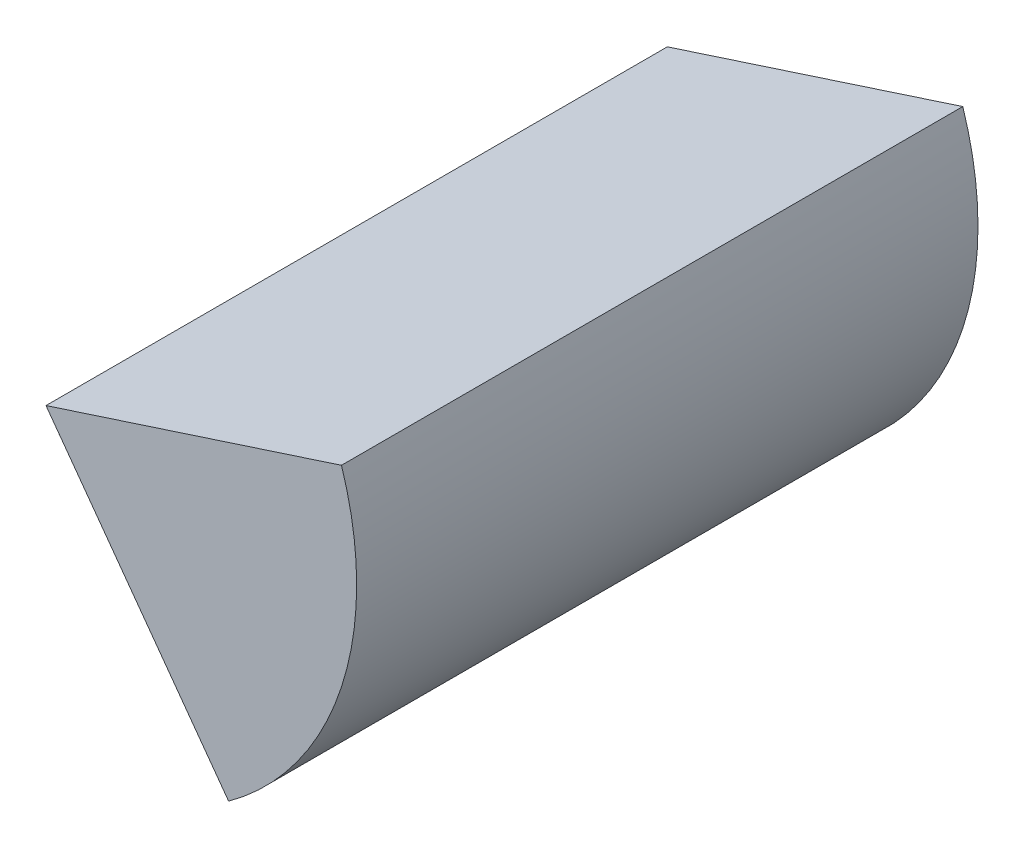
ISO-10303-21;
HEADER;
FILE_DESCRIPTION(('STEP AP214'),'2;1');
FILE_NAME('part.step','',(''),(''),'','','');
FILE_SCHEMA(('AUTOMOTIVE_DESIGN { 1 0 10303 214 1 1 1 1 }'));
ENDSEC;
DATA;
#1=APPLICATION_CONTEXT('core data for automotive mechanical design processes');
#2=APPLICATION_PROTOCOL_DEFINITION('international standard','automotive_design',2000,#1);
#3=PRODUCT_CONTEXT('',#1,'mechanical');
#4=PRODUCT('Part','Part','',(#3));
#5=PRODUCT_RELATED_PRODUCT_CATEGORY('part','',(#4));
#6=PRODUCT_DEFINITION_FORMATION('','',#4);
#7=PRODUCT_DEFINITION_CONTEXT('part definition',#1,'design');
#8=PRODUCT_DEFINITION('design','',#6,#7);
#9=PRODUCT_DEFINITION_SHAPE('','',#8);
#10=(LENGTH_UNIT() NAMED_UNIT(*) SI_UNIT(.MILLI.,.METRE.));
#11=(NAMED_UNIT(*) PLANE_ANGLE_UNIT() SI_UNIT($,.RADIAN.));
#12=(NAMED_UNIT(*) SI_UNIT($,.STERADIAN.) SOLID_ANGLE_UNIT());
#13=UNCERTAINTY_MEASURE_WITH_UNIT(LENGTH_MEASURE(1.E-05),#10,'distance_accuracy_value','');
#14=(GEOMETRIC_REPRESENTATION_CONTEXT(3) GLOBAL_UNCERTAINTY_ASSIGNED_CONTEXT((#13)) GLOBAL_UNIT_ASSIGNED_CONTEXT((#10,
#11,#12)) REPRESENTATION_CONTEXT('',''));
#15=CARTESIAN_POINT('',(0.,0.,0.));
#16=DIRECTION('',(0.,0.,1.));
#17=DIRECTION('',(1.,0.,0.));
#18=AXIS2_PLACEMENT_3D('',#15,#16,#17);
#19=CARTESIAN_POINT('',(0.,0.,50.));
#20=DIRECTION('',(0.809016994374946,0.587785252292475,0.));
#21=DIRECTION('',(-0.587785252292475,0.809016994374946,0.));
#22=AXIS2_PLACEMENT_3D('',#19,#20,#21);
#23=PLANE('',#22);
#24=DIRECTION('',(0.587785252292475,-0.809016994374946,0.));
#25=VECTOR('',#24,1.);
#26=CARTESIAN_POINT('',(0.,0.,0.));
#27=LINE('',#26,#25);
#28=CARTESIAN_POINT('',(0.,0.,0.));
#29=VERTEX_POINT('',#28);
#30=CARTESIAN_POINT('',(14.6946313073119,-20.2254248593737,0.));
#31=VERTEX_POINT('',#30);
#32=EDGE_CURVE('E80',#29,#31,#27,.T.);
#33=ORIENTED_EDGE('',*,*,#32,.T.);
#34=DIRECTION('',(0.,0.,-1.));
#35=VECTOR('',#34,1.);
#36=CARTESIAN_POINT('',(14.6946313073119,-20.2254248593737,50.));
#37=LINE('',#36,#35);
#38=CARTESIAN_POINT('',(14.6946313073119,-20.2254248593737,50.));
#39=VERTEX_POINT('',#38);
#40=EDGE_CURVE('E11',#39,#31,#37,.T.);
#41=ORIENTED_EDGE('',*,*,#40,.F.);
#42=DIRECTION('',(0.587785252292475,-0.809016994374946,0.));
#43=VECTOR('',#42,1.);
#44=CARTESIAN_POINT('',(0.,0.,50.));
#45=LINE('',#44,#43);
#46=CARTESIAN_POINT('',(0.,0.,50.));
#47=VERTEX_POINT('',#46);
#48=EDGE_CURVE('E73',#47,#39,#45,.T.);
#49=ORIENTED_EDGE('',*,*,#48,.F.);
#50=DIRECTION('',(0.,0.,-1.));
#51=VECTOR('',#50,1.);
#52=CARTESIAN_POINT('',(0.,0.,50.));
#53=LINE('',#52,#51);
#54=EDGE_CURVE('E81',#47,#29,#53,.T.);
#55=ORIENTED_EDGE('',*,*,#54,.T.);
#56=EDGE_LOOP('',(#33,#41,#49,#55));
#57=FACE_BOUND('',#56,.T.);
#58=ADVANCED_FACE('F33',(#57),#23,.F.);
#59=CARTESIAN_POINT('',(0.,0.,50.));
#60=DIRECTION('',(0.,0.,-1.));
#61=DIRECTION('',(-1.,0.,0.));
#62=AXIS2_PLACEMENT_3D('',#59,#60,#61);
#63=CYLINDRICAL_SURFACE('',#62,25.);
#64=CARTESIAN_POINT('',(0.,0.,0.));
#65=DIRECTION('',(0.,0.,1.));
#66=DIRECTION('',(1.,0.,0.));
#67=AXIS2_PLACEMENT_3D('',#64,#65,#66);
#68=CIRCLE('',#67,25.);
#69=CARTESIAN_POINT('',(23.7764129073788,7.72542485937379,0.));
#70=VERTEX_POINT('',#69);
#71=EDGE_CURVE('E61',#31,#70,#68,.T.);
#72=ORIENTED_EDGE('',*,*,#71,.T.);
#73=DIRECTION('',(0.,0.,-1.));
#74=VECTOR('',#73,1.);
#75=CARTESIAN_POINT('',(23.7764129073788,7.72542485937379,50.));
#76=LINE('',#75,#74);
#77=CARTESIAN_POINT('',(23.7764129073788,7.72542485937379,50.));
#78=VERTEX_POINT('',#77);
#79=EDGE_CURVE('E41',#78,#70,#76,.T.);
#80=ORIENTED_EDGE('',*,*,#79,.F.);
#81=CARTESIAN_POINT('',(0.,0.,50.));
#82=DIRECTION('',(0.,0.,1.));
#83=DIRECTION('',(1.,0.,0.));
#84=AXIS2_PLACEMENT_3D('',#81,#82,#83);
#85=CIRCLE('',#84,25.);
#86=EDGE_CURVE('E69',#39,#78,#85,.T.);
#87=ORIENTED_EDGE('',*,*,#86,.F.);
#88=ORIENTED_EDGE('',*,*,#40,.T.);
#89=EDGE_LOOP('',(#72,#80,#87,#88));
#90=FACE_BOUND('',#89,.T.);
#91=ADVANCED_FACE('F70',(#90),#63,.T.);
#92=CARTESIAN_POINT('',(0.,0.,50.));
#93=DIRECTION('',(0.309016994374952,-0.951056516295152,0.));
#94=DIRECTION('',(0.951056516295152,0.309016994374952,0.));
#95=AXIS2_PLACEMENT_3D('',#92,#93,#94);
#96=PLANE('',#95);
#97=DIRECTION('',(-0.951056516295152,-0.309016994374952,0.));
#98=VECTOR('',#97,1.);
#99=CARTESIAN_POINT('',(0.,0.,0.));
#100=LINE('',#99,#98);
#101=EDGE_CURVE('E66',#70,#29,#100,.T.);
#102=ORIENTED_EDGE('',*,*,#101,.T.);
#103=ORIENTED_EDGE('',*,*,#54,.F.);
#104=DIRECTION('',(-0.951056516295152,-0.309016994374952,0.));
#105=VECTOR('',#104,1.);
#106=CARTESIAN_POINT('',(0.,0.,50.));
#107=LINE('',#106,#105);
#108=EDGE_CURVE('E49',#78,#47,#107,.T.);
#109=ORIENTED_EDGE('',*,*,#108,.F.);
#110=ORIENTED_EDGE('',*,*,#79,.T.);
#111=EDGE_LOOP('',(#102,#103,#109,#110));
#112=FACE_BOUND('',#111,.T.);
#113=ADVANCED_FACE('F92',(#112),#96,.F.);
#114=CARTESIAN_POINT('',(0.,0.,50.));
#115=DIRECTION('',(0.,0.,1.));
#116=DIRECTION('',(1.,0.,0.));
#117=AXIS2_PLACEMENT_3D('',#114,#115,#116);
#118=PLANE('',#117);
#119=ORIENTED_EDGE('',*,*,#48,.T.);
#120=ORIENTED_EDGE('',*,*,#86,.T.);
#121=ORIENTED_EDGE('',*,*,#108,.T.);
#122=EDGE_LOOP('',(#119,#120,#121));
#123=FACE_BOUND('',#122,.T.);
#124=ADVANCED_FACE('F76',(#123),#118,.T.);
#125=CARTESIAN_POINT('',(0.,0.,0.));
#126=DIRECTION('',(0.,0.,1.));
#127=DIRECTION('',(1.,0.,0.));
#128=AXIS2_PLACEMENT_3D('',#125,#126,#127);
#129=PLANE('',#128);
#130=CARTESIAN_POINT('',(15.1663310268896,-4.65546277928046,0.));
#131=DIRECTION('',(0.,0.,-1.));
#132=DIRECTION('',(-1.,0.,0.));
#133=AXIS2_PLACEMENT_3D('',#130,#131,#132);
#134=CIRCLE('',#133,5.);
#135=CARTESIAN_POINT('',(10.1663310268896,-4.65546277928046,0.));
#136=VERTEX_POINT('',#135);
#137=EDGE_CURVE('E87',#136,#136,#134,.T.);
#138=ORIENTED_EDGE('',*,*,#137,.F.);
#139=EDGE_LOOP('',(#138));
#140=FACE_BOUND('',#139,.T.);
#141=ORIENTED_EDGE('',*,*,#32,.F.);
#142=ORIENTED_EDGE('',*,*,#101,.F.);
#143=ORIENTED_EDGE('',*,*,#71,.F.);
#144=EDGE_LOOP('',(#141,#142,#143));
#145=FACE_BOUND('',#144,.T.);
#146=ADVANCED_FACE('F93',(#140,#145),#129,.F.);
#147=CARTESIAN_POINT('',(15.1663310268896,-4.65546277928046,10.));
#148=DIRECTION('',(0.,0.,-1.));
#149=DIRECTION('',(-1.,0.,0.));
#150=AXIS2_PLACEMENT_3D('',#147,#148,#149);
#151=CYLINDRICAL_SURFACE('',#150,5.);
#152=CARTESIAN_POINT('',(15.1663310268896,-4.65546277928046,10.));
#153=DIRECTION('',(0.,0.,-1.));
#154=DIRECTION('',(-1.,0.,0.));
#155=AXIS2_PLACEMENT_3D('',#152,#153,#154);
#156=CIRCLE('',#155,5.);
#157=CARTESIAN_POINT('',(10.1663310268896,-4.65546277928046,10.));
#158=VERTEX_POINT('',#157);
#159=EDGE_CURVE('E83',#158,#158,#156,.T.);
#160=ORIENTED_EDGE('',*,*,#159,.F.);
#161=EDGE_LOOP('',(#160));
#162=FACE_BOUND('',#161,.T.);
#163=ORIENTED_EDGE('',*,*,#137,.T.);
#164=EDGE_LOOP('',(#163));
#165=FACE_BOUND('',#164,.T.);
#166=ADVANCED_FACE('F95',(#162,#165),#151,.F.);
#167=CARTESIAN_POINT('',(15.1663310268896,-4.65546277928046,10.));
#168=DIRECTION('',(0.,0.,-1.));
#169=DIRECTION('',(-1.,0.,0.));
#170=AXIS2_PLACEMENT_3D('',#167,#168,#169);
#171=PLANE('',#170);
#172=ORIENTED_EDGE('',*,*,#159,.T.);
#173=EDGE_LOOP('',(#172));
#174=FACE_BOUND('',#173,.T.);
#175=ADVANCED_FACE('F102',(#174),#171,.T.);
#176=CLOSED_SHELL('',(#58,#91,#113,#124,#146,#166,#175));
#177=MANIFOLD_SOLID_BREP('B2',#176);
#178=ADVANCED_BREP_SHAPE_REPRESENTATION('',(#18,#177),#14);
#179=SHAPE_DEFINITION_REPRESENTATION(#9,#178);
ENDSEC;
END-ISO-10303-21;
